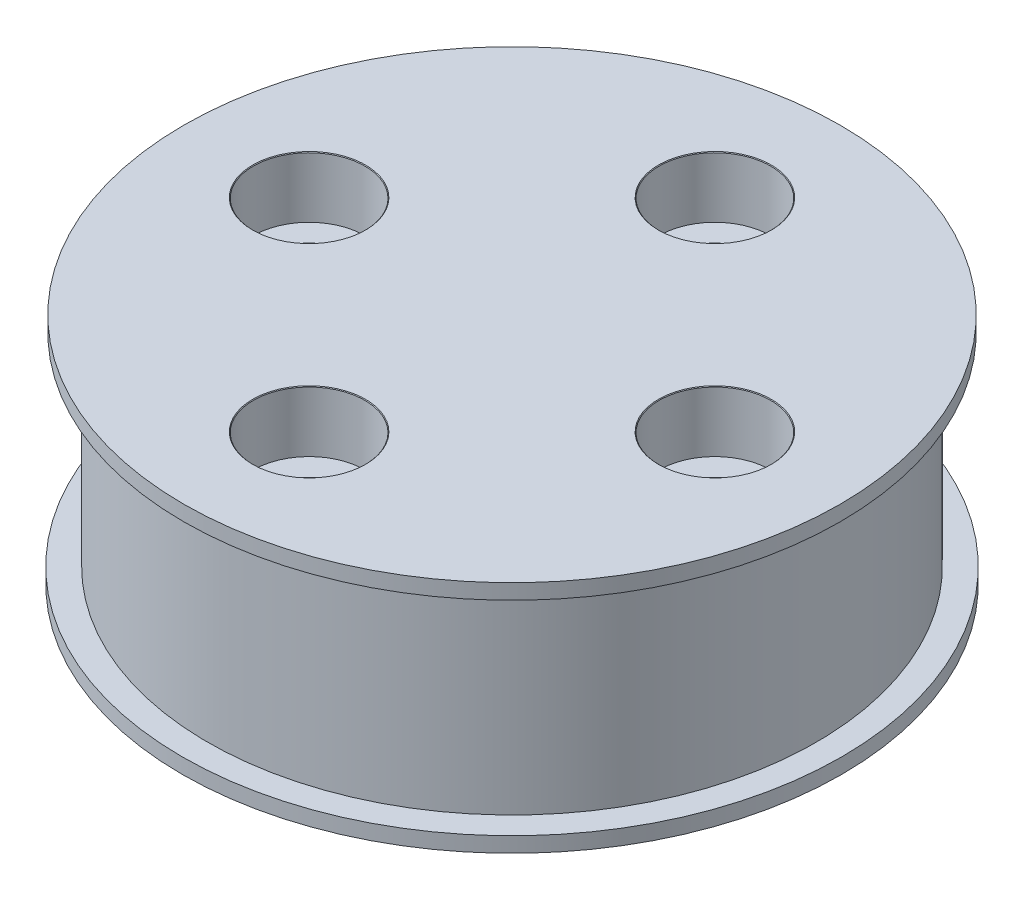
ISO-10303-21;
HEADER;
FILE_DESCRIPTION(('STEP AP214'),'2;1');
FILE_NAME('part.step','',(''),(''),'','','');
FILE_SCHEMA(('AUTOMOTIVE_DESIGN { 1 0 10303 214 1 1 1 1 }'));
ENDSEC;
DATA;
#1=APPLICATION_CONTEXT('core data for automotive mechanical design processes');
#2=APPLICATION_PROTOCOL_DEFINITION('international standard','automotive_design',2000,#1);
#3=PRODUCT_CONTEXT('',#1,'mechanical');
#4=PRODUCT('Part','Part','',(#3));
#5=PRODUCT_RELATED_PRODUCT_CATEGORY('part','',(#4));
#6=PRODUCT_DEFINITION_FORMATION('','',#4);
#7=PRODUCT_DEFINITION_CONTEXT('part definition',#1,'design');
#8=PRODUCT_DEFINITION('design','',#6,#7);
#9=PRODUCT_DEFINITION_SHAPE('','',#8);
#10=(LENGTH_UNIT() NAMED_UNIT(*) SI_UNIT(.MILLI.,.METRE.));
#11=(NAMED_UNIT(*) PLANE_ANGLE_UNIT() SI_UNIT($,.RADIAN.));
#12=(NAMED_UNIT(*) SI_UNIT($,.STERADIAN.) SOLID_ANGLE_UNIT());
#13=UNCERTAINTY_MEASURE_WITH_UNIT(LENGTH_MEASURE(1.E-05),#10,'distance_accuracy_value','');
#14=(GEOMETRIC_REPRESENTATION_CONTEXT(3) GLOBAL_UNCERTAINTY_ASSIGNED_CONTEXT((#13)) GLOBAL_UNIT_ASSIGNED_CONTEXT((#10,
#11,#12)) REPRESENTATION_CONTEXT('',''));
#15=CARTESIAN_POINT('',(0.,0.,0.));
#16=DIRECTION('',(0.,0.,1.));
#17=DIRECTION('',(1.,0.,0.));
#18=AXIS2_PLACEMENT_3D('',#15,#16,#17);
#19=CARTESIAN_POINT('',(0.,0.,0.));
#20=DIRECTION('',(0.,1.,0.));
#21=DIRECTION('',(-1.,0.,0.));
#22=AXIS2_PLACEMENT_3D('',#19,#20,#21);
#23=PLANE('',#22);
#24=CARTESIAN_POINT('',(0.,0.,0.));
#25=DIRECTION('',(0.,-1.,0.));
#26=DIRECTION('',(0.,0.,-1.));
#27=AXIS2_PLACEMENT_3D('',#24,#25,#26);
#28=CIRCLE('',#27,4.);
#29=CARTESIAN_POINT('',(0.,0.,-4.));
#30=VERTEX_POINT('',#29);
#31=EDGE_CURVE('E155',#30,#30,#28,.T.);
#32=ORIENTED_EDGE('',*,*,#31,.F.);
#33=EDGE_LOOP('',(#32));
#34=FACE_BOUND('',#33,.T.);
#35=CARTESIAN_POINT('',(0.,0.,-8.));
#36=DIRECTION('',(0.,1.,0.));
#37=DIRECTION('',(0.,0.,1.));
#38=AXIS2_PLACEMENT_3D('',#35,#36,#37);
#39=CIRCLE('',#38,1.2);
#40=CARTESIAN_POINT('',(0.,0.,-6.8));
#41=VERTEX_POINT('',#40);
#42=EDGE_CURVE('E134',#41,#41,#39,.T.);
#43=ORIENTED_EDGE('',*,*,#42,.T.);
#44=EDGE_LOOP('',(#43));
#45=FACE_BOUND('',#44,.T.);
#46=CARTESIAN_POINT('',(8.00000000000023,0.,-2.25904099284255E-13));
#47=DIRECTION('',(0.,1.,0.));
#48=DIRECTION('',(0.,0.,1.));
#49=AXIS2_PLACEMENT_3D('',#46,#47,#48);
#50=CIRCLE('',#49,1.2);
#51=CARTESIAN_POINT('',(8.00000000000023,0.,1.19999999999977));
#52=VERTEX_POINT('',#51);
#53=EDGE_CURVE('E114',#52,#52,#50,.T.);
#54=ORIENTED_EDGE('',*,*,#53,.T.);
#55=EDGE_LOOP('',(#54));
#56=FACE_BOUND('',#55,.T.);
#57=CARTESIAN_POINT('',(4.5180819856851E-13,0.,8.));
#58=DIRECTION('',(0.,1.,0.));
#59=DIRECTION('',(0.,0.,1.));
#60=AXIS2_PLACEMENT_3D('',#57,#58,#59);
#61=CIRCLE('',#60,1.2);
#62=CARTESIAN_POINT('',(4.5180819856851E-13,0.,9.2));
#63=VERTEX_POINT('',#62);
#64=EDGE_CURVE('E94',#63,#63,#61,.T.);
#65=ORIENTED_EDGE('',*,*,#64,.T.);
#66=EDGE_LOOP('',(#65));
#67=FACE_BOUND('',#66,.T.);
#68=CARTESIAN_POINT('',(-7.99999999999977,0.,2.24924381844937E-13));
#69=DIRECTION('',(0.,1.,0.));
#70=DIRECTION('',(0.,0.,1.));
#71=AXIS2_PLACEMENT_3D('',#68,#69,#70);
#72=CIRCLE('',#71,1.2);
#73=CARTESIAN_POINT('',(-7.99999999999977,0.,1.20000000000022));
#74=VERTEX_POINT('',#73);
#75=EDGE_CURVE('E74',#74,#74,#72,.T.);
#76=ORIENTED_EDGE('',*,*,#75,.T.);
#77=EDGE_LOOP('',(#76));
#78=FACE_BOUND('',#77,.T.);
#79=CARTESIAN_POINT('',(0.,0.,0.));
#80=DIRECTION('',(0.,1.,0.));
#81=DIRECTION('',(-1.,0.,0.));
#82=AXIS2_PLACEMENT_3D('',#79,#80,#81);
#83=CIRCLE('',#82,13.);
#84=CARTESIAN_POINT('',(-13.,0.,0.));
#85=VERTEX_POINT('',#84);
#86=EDGE_CURVE('E10',#85,#85,#83,.T.);
#87=ORIENTED_EDGE('',*,*,#86,.F.);
#88=EDGE_LOOP('',(#87));
#89=FACE_BOUND('',#88,.T.);
#90=ADVANCED_FACE('F43',(#34,#45,#56,#67,#78,#89),#23,.F.);
#91=CARTESIAN_POINT('',(0.,9.2,0.));
#92=DIRECTION('',(0.,1.,0.));
#93=DIRECTION('',(-1.,0.,0.));
#94=AXIS2_PLACEMENT_3D('',#91,#92,#93);
#95=CYLINDRICAL_SURFACE('',#94,13.);
#96=CARTESIAN_POINT('',(0.,0.600000000000002,0.));
#97=DIRECTION('',(0.,1.,0.));
#98=DIRECTION('',(-1.,0.,0.));
#99=AXIS2_PLACEMENT_3D('',#96,#97,#98);
#100=CIRCLE('',#99,13.);
#101=CARTESIAN_POINT('',(-13.,0.600000000000002,0.));
#102=VERTEX_POINT('',#101);
#103=EDGE_CURVE('E50',#102,#102,#100,.T.);
#104=ORIENTED_EDGE('',*,*,#103,.F.);
#105=EDGE_LOOP('',(#104));
#106=FACE_BOUND('',#105,.T.);
#107=ORIENTED_EDGE('',*,*,#86,.T.);
#108=EDGE_LOOP('',(#107));
#109=FACE_BOUND('',#108,.T.);
#110=ADVANCED_FACE('F174',(#106,#109),#95,.T.);
#111=CARTESIAN_POINT('',(13.,0.600000000000002,0.));
#112=DIRECTION('',(0.,-1.,0.));
#113=DIRECTION('',(1.,0.,0.));
#114=AXIS2_PLACEMENT_3D('',#111,#112,#113);
#115=PLANE('',#114);
#116=CARTESIAN_POINT('',(0.,0.600000000000002,0.));
#117=DIRECTION('',(0.,1.,0.));
#118=DIRECTION('',(-1.,0.,0.));
#119=AXIS2_PLACEMENT_3D('',#116,#117,#118);
#120=CIRCLE('',#119,12.);
#121=CARTESIAN_POINT('',(-12.,0.600000000000002,0.));
#122=VERTEX_POINT('',#121);
#123=EDGE_CURVE('E55',#122,#122,#120,.T.);
#124=ORIENTED_EDGE('',*,*,#123,.F.);
#125=EDGE_LOOP('',(#124));
#126=FACE_BOUND('',#125,.T.);
#127=ORIENTED_EDGE('',*,*,#103,.T.);
#128=EDGE_LOOP('',(#127));
#129=FACE_BOUND('',#128,.T.);
#130=ADVANCED_FACE('F231',(#126,#129),#115,.F.);
#131=CARTESIAN_POINT('',(0.,9.2,0.));
#132=DIRECTION('',(0.,1.,0.));
#133=DIRECTION('',(-1.,0.,0.));
#134=AXIS2_PLACEMENT_3D('',#131,#132,#133);
#135=CYLINDRICAL_SURFACE('',#134,12.);
#136=CARTESIAN_POINT('',(0.,8.6,0.));
#137=DIRECTION('',(0.,1.,0.));
#138=DIRECTION('',(-1.,0.,0.));
#139=AXIS2_PLACEMENT_3D('',#136,#137,#138);
#140=CIRCLE('',#139,12.);
#141=CARTESIAN_POINT('',(-12.,8.6,0.));
#142=VERTEX_POINT('',#141);
#143=EDGE_CURVE('E60',#142,#142,#140,.T.);
#144=ORIENTED_EDGE('',*,*,#143,.F.);
#145=EDGE_LOOP('',(#144));
#146=FACE_BOUND('',#145,.T.);
#147=ORIENTED_EDGE('',*,*,#123,.T.);
#148=EDGE_LOOP('',(#147));
#149=FACE_BOUND('',#148,.T.);
#150=ADVANCED_FACE('F225',(#146,#149),#135,.T.);
#151=CARTESIAN_POINT('',(12.,8.6,0.));
#152=DIRECTION('',(0.,1.,0.));
#153=DIRECTION('',(-1.,0.,0.));
#154=AXIS2_PLACEMENT_3D('',#151,#152,#153);
#155=PLANE('',#154);
#156=CARTESIAN_POINT('',(0.,8.6,0.));
#157=DIRECTION('',(0.,1.,0.));
#158=DIRECTION('',(-1.,0.,0.));
#159=AXIS2_PLACEMENT_3D('',#156,#157,#158);
#160=CIRCLE('',#159,12.9428571428571);
#161=CARTESIAN_POINT('',(-12.9428571428571,8.6,0.));
#162=VERTEX_POINT('',#161);
#163=EDGE_CURVE('E66',#162,#162,#160,.T.);
#164=ORIENTED_EDGE('',*,*,#163,.F.);
#165=EDGE_LOOP('',(#164));
#166=FACE_BOUND('',#165,.T.);
#167=ORIENTED_EDGE('',*,*,#143,.T.);
#168=EDGE_LOOP('',(#167));
#169=FACE_BOUND('',#168,.T.);
#170=ADVANCED_FACE('F219',(#166,#169),#155,.F.);
#171=CARTESIAN_POINT('',(0.,9.2,0.));
#172=DIRECTION('',(0.,1.,0.));
#173=DIRECTION('',(-1.,0.,0.));
#174=AXIS2_PLACEMENT_3D('',#171,#172,#173);
#175=CYLINDRICAL_SURFACE('',#174,12.9428571428571);
#176=CARTESIAN_POINT('',(0.,9.2,0.));
#177=DIRECTION('',(0.,1.,0.));
#178=DIRECTION('',(-1.,0.,0.));
#179=AXIS2_PLACEMENT_3D('',#176,#177,#178);
#180=CIRCLE('',#179,12.9428571428571);
#181=CARTESIAN_POINT('',(-12.9428571428571,9.2,0.));
#182=VERTEX_POINT('',#181);
#183=EDGE_CURVE('E70',#182,#182,#180,.T.);
#184=ORIENTED_EDGE('',*,*,#183,.F.);
#185=EDGE_LOOP('',(#184));
#186=FACE_BOUND('',#185,.T.);
#187=ORIENTED_EDGE('',*,*,#163,.T.);
#188=EDGE_LOOP('',(#187));
#189=FACE_BOUND('',#188,.T.);
#190=ADVANCED_FACE('F212',(#186,#189),#175,.T.);
#191=CARTESIAN_POINT('',(12.9428571428571,9.2,0.));
#192=DIRECTION('',(0.,-1.,0.));
#193=DIRECTION('',(1.,0.,0.));
#194=AXIS2_PLACEMENT_3D('',#191,#192,#193);
#195=PLANE('',#194);
#196=CARTESIAN_POINT('',(0.,9.2,-8.));
#197=DIRECTION('',(0.,1.,0.));
#198=DIRECTION('',(0.,0.,1.));
#199=AXIS2_PLACEMENT_3D('',#196,#197,#198);
#200=CIRCLE('',#199,2.225);
#201=CARTESIAN_POINT('',(0.,9.2,-5.775));
#202=VERTEX_POINT('',#201);
#203=EDGE_CURVE('E150',#202,#202,#200,.T.);
#204=ORIENTED_EDGE('',*,*,#203,.F.);
#205=EDGE_LOOP('',(#204));
#206=FACE_BOUND('',#205,.T.);
#207=CARTESIAN_POINT('',(8.00000000000023,9.2,-2.25904099284255E-13));
#208=DIRECTION('',(0.,1.,0.));
#209=DIRECTION('',(0.,0.,1.));
#210=AXIS2_PLACEMENT_3D('',#207,#208,#209);
#211=CIRCLE('',#210,2.225);
#212=CARTESIAN_POINT('',(8.00000000000023,9.2,2.22499999999977));
#213=VERTEX_POINT('',#212);
#214=EDGE_CURVE('E130',#213,#213,#211,.T.);
#215=ORIENTED_EDGE('',*,*,#214,.F.);
#216=EDGE_LOOP('',(#215));
#217=FACE_BOUND('',#216,.T.);
#218=CARTESIAN_POINT('',(4.5180819856851E-13,9.2,8.));
#219=DIRECTION('',(0.,1.,0.));
#220=DIRECTION('',(0.,0.,1.));
#221=AXIS2_PLACEMENT_3D('',#218,#219,#220);
#222=CIRCLE('',#221,2.225);
#223=CARTESIAN_POINT('',(4.5180819856851E-13,9.2,10.225));
#224=VERTEX_POINT('',#223);
#225=EDGE_CURVE('E110',#224,#224,#222,.T.);
#226=ORIENTED_EDGE('',*,*,#225,.F.);
#227=EDGE_LOOP('',(#226));
#228=FACE_BOUND('',#227,.T.);
#229=CARTESIAN_POINT('',(-7.99999999999977,9.2,2.24924381844937E-13));
#230=DIRECTION('',(0.,1.,0.));
#231=DIRECTION('',(0.,0.,1.));
#232=AXIS2_PLACEMENT_3D('',#229,#230,#231);
#233=CIRCLE('',#232,2.225);
#234=CARTESIAN_POINT('',(-7.99999999999977,9.2,2.22500000000022));
#235=VERTEX_POINT('',#234);
#236=EDGE_CURVE('E90',#235,#235,#233,.T.);
#237=ORIENTED_EDGE('',*,*,#236,.F.);
#238=EDGE_LOOP('',(#237));
#239=FACE_BOUND('',#238,.T.);
#240=ORIENTED_EDGE('',*,*,#183,.T.);
#241=EDGE_LOOP('',(#240));
#242=FACE_BOUND('',#241,.T.);
#243=ADVANCED_FACE('F188',(#206,#217,#228,#239,#242),#195,.F.);
#244=CARTESIAN_POINT('',(-7.99999999999977,9.2,2.24924381844937E-13));
#245=DIRECTION('',(0.,1.,0.));
#246=DIRECTION('',(0.,0.,1.));
#247=AXIS2_PLACEMENT_3D('',#244,#245,#246);
#248=CYLINDRICAL_SURFACE('',#247,1.2);
#249=ORIENTED_EDGE('',*,*,#75,.F.);
#250=EDGE_LOOP('',(#249));
#251=FACE_BOUND('',#250,.T.);
#252=CARTESIAN_POINT('',(-7.99999999999977,6.8,2.24924381844937E-13));
#253=DIRECTION('',(0.,1.,0.));
#254=DIRECTION('',(0.,0.,1.));
#255=AXIS2_PLACEMENT_3D('',#252,#253,#254);
#256=CIRCLE('',#255,1.2);
#257=CARTESIAN_POINT('',(-7.99999999999977,6.8,1.20000000000022));
#258=VERTEX_POINT('',#257);
#259=EDGE_CURVE('E78',#258,#258,#256,.T.);
#260=ORIENTED_EDGE('',*,*,#259,.T.);
#261=EDGE_LOOP('',(#260));
#262=FACE_BOUND('',#261,.T.);
#263=ADVANCED_FACE('F184',(#251,#262),#248,.F.);
#264=CARTESIAN_POINT('',(-5.79999999999978,6.8,2.24924381844937E-13));
#265=DIRECTION('',(0.,-1.,0.));
#266=DIRECTION('',(0.,0.,-1.));
#267=AXIS2_PLACEMENT_3D('',#264,#265,#266);
#268=PLANE('',#267);
#269=ORIENTED_EDGE('',*,*,#259,.F.);
#270=EDGE_LOOP('',(#269));
#271=FACE_BOUND('',#270,.T.);
#272=CARTESIAN_POINT('',(-7.99999999999977,6.8,2.24924381844937E-13));
#273=DIRECTION('',(0.,1.,0.));
#274=DIRECTION('',(0.,0.,1.));
#275=AXIS2_PLACEMENT_3D('',#272,#273,#274);
#276=CIRCLE('',#275,2.2);
#277=CARTESIAN_POINT('',(-7.99999999999977,6.8,2.20000000000022));
#278=VERTEX_POINT('',#277);
#279=EDGE_CURVE('E82',#278,#278,#276,.T.);
#280=ORIENTED_EDGE('',*,*,#279,.T.);
#281=EDGE_LOOP('',(#280));
#282=FACE_BOUND('',#281,.T.);
#283=ADVANCED_FACE('F187',(#271,#282),#268,.F.);
#284=CARTESIAN_POINT('',(-7.99999999999977,9.2,2.24924381844937E-13));
#285=DIRECTION('',(0.,1.,0.));
#286=DIRECTION('',(0.,0.,1.));
#287=AXIS2_PLACEMENT_3D('',#284,#285,#286);
#288=CYLINDRICAL_SURFACE('',#287,2.2);
#289=ORIENTED_EDGE('',*,*,#279,.F.);
#290=EDGE_LOOP('',(#289));
#291=FACE_BOUND('',#290,.T.);
#292=CARTESIAN_POINT('',(-7.99999999999977,9.175,2.24924381844937E-13));
#293=DIRECTION('',(0.,1.,0.));
#294=DIRECTION('',(0.,0.,1.));
#295=AXIS2_PLACEMENT_3D('',#292,#293,#294);
#296=CIRCLE('',#295,2.2);
#297=CARTESIAN_POINT('',(-7.99999999999977,9.175,2.20000000000023));
#298=VERTEX_POINT('',#297);
#299=EDGE_CURVE('E86',#298,#298,#296,.T.);
#300=ORIENTED_EDGE('',*,*,#299,.T.);
#301=EDGE_LOOP('',(#300));
#302=FACE_BOUND('',#301,.T.);
#303=ADVANCED_FACE('F194',(#291,#302),#288,.F.);
#304=CARTESIAN_POINT('',(-7.99999999999977,9.2,2.24924381844937E-13));
#305=DIRECTION('',(0.,1.,0.));
#306=DIRECTION('',(0.,0.,1.));
#307=AXIS2_PLACEMENT_3D('',#304,#305,#306);
#308=CONICAL_SURFACE('',#307,2.225,0.785398163397448);
#309=ORIENTED_EDGE('',*,*,#299,.F.);
#310=EDGE_LOOP('',(#309));
#311=FACE_BOUND('',#310,.T.);
#312=ORIENTED_EDGE('',*,*,#236,.T.);
#313=EDGE_LOOP('',(#312));
#314=FACE_BOUND('',#313,.T.);
#315=ADVANCED_FACE('F200',(#311,#314),#308,.F.);
#316=CARTESIAN_POINT('',(4.5180819856851E-13,9.2,8.));
#317=DIRECTION('',(0.,1.,0.));
#318=DIRECTION('',(0.,0.,1.));
#319=AXIS2_PLACEMENT_3D('',#316,#317,#318);
#320=CYLINDRICAL_SURFACE('',#319,1.2);
#321=ORIENTED_EDGE('',*,*,#64,.F.);
#322=EDGE_LOOP('',(#321));
#323=FACE_BOUND('',#322,.T.);
#324=CARTESIAN_POINT('',(4.5180819856851E-13,6.8,8.));
#325=DIRECTION('',(0.,1.,0.));
#326=DIRECTION('',(0.,0.,1.));
#327=AXIS2_PLACEMENT_3D('',#324,#325,#326);
#328=CIRCLE('',#327,1.2);
#329=CARTESIAN_POINT('',(4.5180819856851E-13,6.8,9.2));
#330=VERTEX_POINT('',#329);
#331=EDGE_CURVE('E98',#330,#330,#328,.T.);
#332=ORIENTED_EDGE('',*,*,#331,.T.);
#333=EDGE_LOOP('',(#332));
#334=FACE_BOUND('',#333,.T.);
#335=ADVANCED_FACE('F206',(#323,#334),#320,.F.);
#336=CARTESIAN_POINT('',(2.20000000000045,6.8,8.));
#337=DIRECTION('',(0.,-1.,0.));
#338=DIRECTION('',(0.,0.,-1.));
#339=AXIS2_PLACEMENT_3D('',#336,#337,#338);
#340=PLANE('',#339);
#341=ORIENTED_EDGE('',*,*,#331,.F.);
#342=EDGE_LOOP('',(#341));
#343=FACE_BOUND('',#342,.T.);
#344=CARTESIAN_POINT('',(4.5180819856851E-13,6.8,8.));
#345=DIRECTION('',(0.,1.,0.));
#346=DIRECTION('',(0.,0.,1.));
#347=AXIS2_PLACEMENT_3D('',#344,#345,#346);
#348=CIRCLE('',#347,2.2);
#349=CARTESIAN_POINT('',(4.5180819856851E-13,6.8,10.2));
#350=VERTEX_POINT('',#349);
#351=EDGE_CURVE('E102',#350,#350,#348,.T.);
#352=ORIENTED_EDGE('',*,*,#351,.T.);
#353=EDGE_LOOP('',(#352));
#354=FACE_BOUND('',#353,.T.);
#355=ADVANCED_FACE('F244',(#343,#354),#340,.F.);
#356=CARTESIAN_POINT('',(4.5180819856851E-13,9.2,8.));
#357=DIRECTION('',(0.,1.,0.));
#358=DIRECTION('',(0.,0.,1.));
#359=AXIS2_PLACEMENT_3D('',#356,#357,#358);
#360=CYLINDRICAL_SURFACE('',#359,2.2);
#361=ORIENTED_EDGE('',*,*,#351,.F.);
#362=EDGE_LOOP('',(#361));
#363=FACE_BOUND('',#362,.T.);
#364=CARTESIAN_POINT('',(4.5180819856851E-13,9.175,8.));
#365=DIRECTION('',(0.,1.,0.));
#366=DIRECTION('',(0.,0.,1.));
#367=AXIS2_PLACEMENT_3D('',#364,#365,#366);
#368=CIRCLE('',#367,2.2);
#369=CARTESIAN_POINT('',(4.5180819856851E-13,9.175,10.2));
#370=VERTEX_POINT('',#369);
#371=EDGE_CURVE('E106',#370,#370,#368,.T.);
#372=ORIENTED_EDGE('',*,*,#371,.T.);
#373=EDGE_LOOP('',(#372));
#374=FACE_BOUND('',#373,.T.);
#375=ADVANCED_FACE('F248',(#363,#374),#360,.F.);
#376=CARTESIAN_POINT('',(4.5180819856851E-13,9.2,8.));
#377=DIRECTION('',(0.,1.,0.));
#378=DIRECTION('',(0.,0.,1.));
#379=AXIS2_PLACEMENT_3D('',#376,#377,#378);
#380=CONICAL_SURFACE('',#379,2.225,0.785398163397457);
#381=ORIENTED_EDGE('',*,*,#371,.F.);
#382=EDGE_LOOP('',(#381));
#383=FACE_BOUND('',#382,.T.);
#384=ORIENTED_EDGE('',*,*,#225,.T.);
#385=EDGE_LOOP('',(#384));
#386=FACE_BOUND('',#385,.T.);
#387=ADVANCED_FACE('F252',(#383,#386),#380,.F.);
#388=CARTESIAN_POINT('',(8.00000000000023,9.2,-2.25904099284255E-13));
#389=DIRECTION('',(0.,1.,0.));
#390=DIRECTION('',(0.,0.,1.));
#391=AXIS2_PLACEMENT_3D('',#388,#389,#390);
#392=CYLINDRICAL_SURFACE('',#391,1.2);
#393=ORIENTED_EDGE('',*,*,#53,.F.);
#394=EDGE_LOOP('',(#393));
#395=FACE_BOUND('',#394,.T.);
#396=CARTESIAN_POINT('',(8.00000000000023,6.8,-2.25904099284255E-13));
#397=DIRECTION('',(0.,1.,0.));
#398=DIRECTION('',(0.,0.,1.));
#399=AXIS2_PLACEMENT_3D('',#396,#397,#398);
#400=CIRCLE('',#399,1.2);
#401=CARTESIAN_POINT('',(8.00000000000023,6.8,1.19999999999977));
#402=VERTEX_POINT('',#401);
#403=EDGE_CURVE('E118',#402,#402,#400,.T.);
#404=ORIENTED_EDGE('',*,*,#403,.T.);
#405=EDGE_LOOP('',(#404));
#406=FACE_BOUND('',#405,.T.);
#407=ADVANCED_FACE('F256',(#395,#406),#392,.F.);
#408=CARTESIAN_POINT('',(10.2000000000002,6.8,-2.25904099284255E-13));
#409=DIRECTION('',(0.,-1.,0.));
#410=DIRECTION('',(0.,0.,-1.));
#411=AXIS2_PLACEMENT_3D('',#408,#409,#410);
#412=PLANE('',#411);
#413=ORIENTED_EDGE('',*,*,#403,.F.);
#414=EDGE_LOOP('',(#413));
#415=FACE_BOUND('',#414,.T.);
#416=CARTESIAN_POINT('',(8.00000000000023,6.8,-2.25904099284255E-13));
#417=DIRECTION('',(0.,1.,0.));
#418=DIRECTION('',(0.,0.,1.));
#419=AXIS2_PLACEMENT_3D('',#416,#417,#418);
#420=CIRCLE('',#419,2.2);
#421=CARTESIAN_POINT('',(8.00000000000023,6.8,2.19999999999977));
#422=VERTEX_POINT('',#421);
#423=EDGE_CURVE('E122',#422,#422,#420,.T.);
#424=ORIENTED_EDGE('',*,*,#423,.T.);
#425=EDGE_LOOP('',(#424));
#426=FACE_BOUND('',#425,.T.);
#427=ADVANCED_FACE('F260',(#415,#426),#412,.F.);
#428=CARTESIAN_POINT('',(8.00000000000023,9.2,-2.25904099284255E-13));
#429=DIRECTION('',(0.,1.,0.));
#430=DIRECTION('',(0.,0.,1.));
#431=AXIS2_PLACEMENT_3D('',#428,#429,#430);
#432=CYLINDRICAL_SURFACE('',#431,2.2);
#433=ORIENTED_EDGE('',*,*,#423,.F.);
#434=EDGE_LOOP('',(#433));
#435=FACE_BOUND('',#434,.T.);
#436=CARTESIAN_POINT('',(8.00000000000023,9.175,-2.25904099284255E-13));
#437=DIRECTION('',(0.,1.,0.));
#438=DIRECTION('',(0.,0.,1.));
#439=AXIS2_PLACEMENT_3D('',#436,#437,#438);
#440=CIRCLE('',#439,2.2);
#441=CARTESIAN_POINT('',(8.00000000000023,9.175,2.19999999999977));
#442=VERTEX_POINT('',#441);
#443=EDGE_CURVE('E126',#442,#442,#440,.T.);
#444=ORIENTED_EDGE('',*,*,#443,.T.);
#445=EDGE_LOOP('',(#444));
#446=FACE_BOUND('',#445,.T.);
#447=ADVANCED_FACE('F264',(#435,#446),#432,.F.);
#448=CARTESIAN_POINT('',(8.00000000000023,9.2,-2.25904099284255E-13));
#449=DIRECTION('',(0.,1.,0.));
#450=DIRECTION('',(0.,0.,1.));
#451=AXIS2_PLACEMENT_3D('',#448,#449,#450);
#452=CONICAL_SURFACE('',#451,2.225,0.785398163397448);
#453=ORIENTED_EDGE('',*,*,#443,.F.);
#454=EDGE_LOOP('',(#453));
#455=FACE_BOUND('',#454,.T.);
#456=ORIENTED_EDGE('',*,*,#214,.T.);
#457=EDGE_LOOP('',(#456));
#458=FACE_BOUND('',#457,.T.);
#459=ADVANCED_FACE('F268',(#455,#458),#452,.F.);
#460=CARTESIAN_POINT('',(0.,9.2,-8.));
#461=DIRECTION('',(0.,1.,0.));
#462=DIRECTION('',(0.,0.,1.));
#463=AXIS2_PLACEMENT_3D('',#460,#461,#462);
#464=CYLINDRICAL_SURFACE('',#463,1.2);
#465=ORIENTED_EDGE('',*,*,#42,.F.);
#466=EDGE_LOOP('',(#465));
#467=FACE_BOUND('',#466,.T.);
#468=CARTESIAN_POINT('',(0.,6.8,-8.));
#469=DIRECTION('',(0.,1.,0.));
#470=DIRECTION('',(0.,0.,1.));
#471=AXIS2_PLACEMENT_3D('',#468,#469,#470);
#472=CIRCLE('',#471,1.2);
#473=CARTESIAN_POINT('',(0.,6.8,-6.8));
#474=VERTEX_POINT('',#473);
#475=EDGE_CURVE('E138',#474,#474,#472,.T.);
#476=ORIENTED_EDGE('',*,*,#475,.T.);
#477=EDGE_LOOP('',(#476));
#478=FACE_BOUND('',#477,.T.);
#479=ADVANCED_FACE('F272',(#467,#478),#464,.F.);
#480=CARTESIAN_POINT('',(2.2,6.8,-8.));
#481=DIRECTION('',(0.,-1.,0.));
#482=DIRECTION('',(0.,0.,-1.));
#483=AXIS2_PLACEMENT_3D('',#480,#481,#482);
#484=PLANE('',#483);
#485=ORIENTED_EDGE('',*,*,#475,.F.);
#486=EDGE_LOOP('',(#485));
#487=FACE_BOUND('',#486,.T.);
#488=CARTESIAN_POINT('',(0.,6.8,-8.));
#489=DIRECTION('',(0.,1.,0.));
#490=DIRECTION('',(0.,0.,1.));
#491=AXIS2_PLACEMENT_3D('',#488,#489,#490);
#492=CIRCLE('',#491,2.2);
#493=CARTESIAN_POINT('',(0.,6.8,-5.8));
#494=VERTEX_POINT('',#493);
#495=EDGE_CURVE('E142',#494,#494,#492,.T.);
#496=ORIENTED_EDGE('',*,*,#495,.T.);
#497=EDGE_LOOP('',(#496));
#498=FACE_BOUND('',#497,.T.);
#499=ADVANCED_FACE('F276',(#487,#498),#484,.F.);
#500=CARTESIAN_POINT('',(0.,9.2,-8.));
#501=DIRECTION('',(0.,1.,0.));
#502=DIRECTION('',(0.,0.,1.));
#503=AXIS2_PLACEMENT_3D('',#500,#501,#502);
#504=CYLINDRICAL_SURFACE('',#503,2.2);
#505=ORIENTED_EDGE('',*,*,#495,.F.);
#506=EDGE_LOOP('',(#505));
#507=FACE_BOUND('',#506,.T.);
#508=CARTESIAN_POINT('',(0.,9.175,-8.));
#509=DIRECTION('',(0.,1.,0.));
#510=DIRECTION('',(0.,0.,1.));
#511=AXIS2_PLACEMENT_3D('',#508,#509,#510);
#512=CIRCLE('',#511,2.2);
#513=CARTESIAN_POINT('',(0.,9.175,-5.8));
#514=VERTEX_POINT('',#513);
#515=EDGE_CURVE('E146',#514,#514,#512,.T.);
#516=ORIENTED_EDGE('',*,*,#515,.T.);
#517=EDGE_LOOP('',(#516));
#518=FACE_BOUND('',#517,.T.);
#519=ADVANCED_FACE('F280',(#507,#518),#504,.F.);
#520=CARTESIAN_POINT('',(0.,9.2,-8.));
#521=DIRECTION('',(0.,1.,0.));
#522=DIRECTION('',(0.,0.,1.));
#523=AXIS2_PLACEMENT_3D('',#520,#521,#522);
#524=CONICAL_SURFACE('',#523,2.225,0.785398163397457);
#525=ORIENTED_EDGE('',*,*,#515,.F.);
#526=EDGE_LOOP('',(#525));
#527=FACE_BOUND('',#526,.T.);
#528=ORIENTED_EDGE('',*,*,#203,.T.);
#529=EDGE_LOOP('',(#528));
#530=FACE_BOUND('',#529,.T.);
#531=ADVANCED_FACE('F168',(#527,#530),#524,.F.);
#532=CARTESIAN_POINT('',(0.,2.5,0.));
#533=DIRECTION('',(0.,-1.,0.));
#534=DIRECTION('',(0.,0.,-1.));
#535=AXIS2_PLACEMENT_3D('',#532,#533,#534);
#536=CYLINDRICAL_SURFACE('',#535,4.);
#537=CARTESIAN_POINT('',(0.,2.5,0.));
#538=DIRECTION('',(0.,-1.,0.));
#539=DIRECTION('',(0.,0.,-1.));
#540=AXIS2_PLACEMENT_3D('',#537,#538,#539);
#541=CIRCLE('',#540,4.);
#542=CARTESIAN_POINT('',(0.,2.5,-4.));
#543=VERTEX_POINT('',#542);
#544=EDGE_CURVE('E154',#543,#543,#541,.T.);
#545=ORIENTED_EDGE('',*,*,#544,.F.);
#546=EDGE_LOOP('',(#545));
#547=FACE_BOUND('',#546,.T.);
#548=ORIENTED_EDGE('',*,*,#31,.T.);
#549=EDGE_LOOP('',(#548));
#550=FACE_BOUND('',#549,.T.);
#551=ADVANCED_FACE('F165',(#547,#550),#536,.F.);
#552=CARTESIAN_POINT('',(0.,2.5,0.));
#553=DIRECTION('',(0.,-1.,0.));
#554=DIRECTION('',(0.,0.,-1.));
#555=AXIS2_PLACEMENT_3D('',#552,#553,#554);
#556=PLANE('',#555);
#557=ORIENTED_EDGE('',*,*,#544,.T.);
#558=EDGE_LOOP('',(#557));
#559=FACE_BOUND('',#558,.T.);
#560=ADVANCED_FACE('F163',(#559),#556,.T.);
#561=CLOSED_SHELL('',(#90,#110,#130,#150,#170,#190,#243,#263,#283,#303,#315,#335,#355,#375,#387,
#407,#427,#447,#459,#479,#499,#519,#531,#551,#560));
#562=MANIFOLD_SOLID_BREP('B2',#561);
#563=ADVANCED_BREP_SHAPE_REPRESENTATION('',(#18,#562),#14);
#564=SHAPE_DEFINITION_REPRESENTATION(#9,#563);
ENDSEC;
END-ISO-10303-21;
